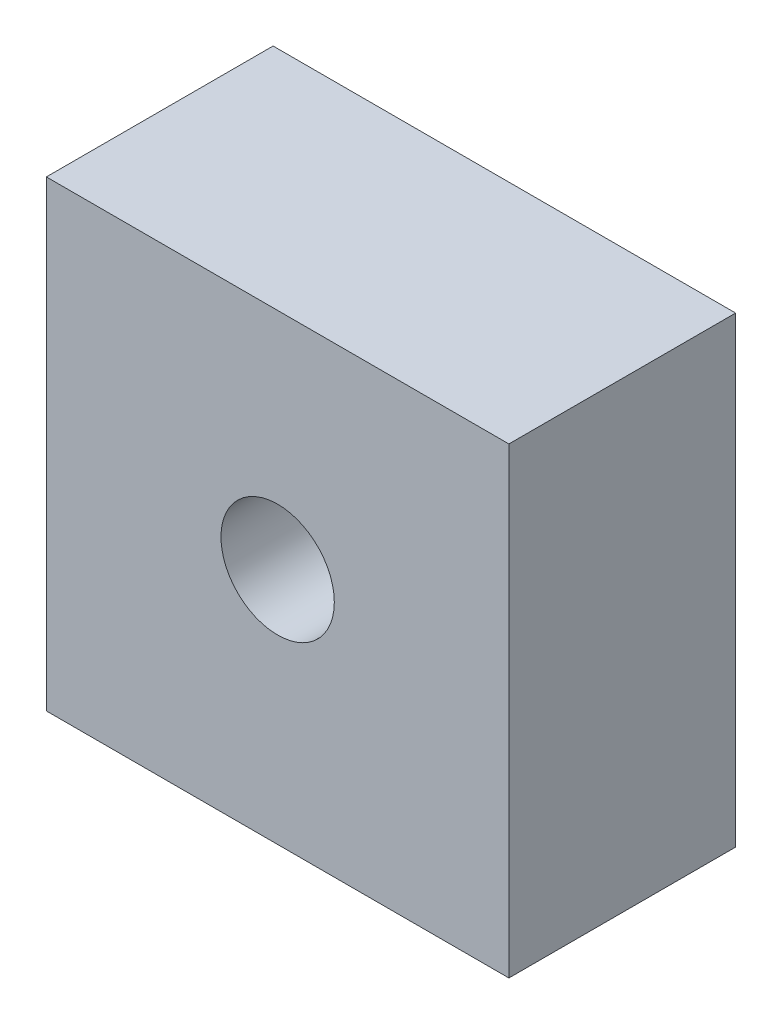
ISO-10303-21;
HEADER;
FILE_DESCRIPTION(('STEP AP214'),'2;1');
FILE_NAME('part.step','',(''),(''),'','','');
FILE_SCHEMA(('AUTOMOTIVE_DESIGN { 1 0 10303 214 1 1 1 1 }'));
ENDSEC;
DATA;
#1=APPLICATION_CONTEXT('core data for automotive mechanical design processes');
#2=APPLICATION_PROTOCOL_DEFINITION('international standard','automotive_design',2000,#1);
#3=PRODUCT_CONTEXT('',#1,'mechanical');
#4=PRODUCT('Part','Part','',(#3));
#5=PRODUCT_RELATED_PRODUCT_CATEGORY('part','',(#4));
#6=PRODUCT_DEFINITION_FORMATION('','',#4);
#7=PRODUCT_DEFINITION_CONTEXT('part definition',#1,'design');
#8=PRODUCT_DEFINITION('design','',#6,#7);
#9=PRODUCT_DEFINITION_SHAPE('','',#8);
#10=(LENGTH_UNIT() NAMED_UNIT(*) SI_UNIT(.MILLI.,.METRE.));
#11=(NAMED_UNIT(*) PLANE_ANGLE_UNIT() SI_UNIT($,.RADIAN.));
#12=(NAMED_UNIT(*) SI_UNIT($,.STERADIAN.) SOLID_ANGLE_UNIT());
#13=UNCERTAINTY_MEASURE_WITH_UNIT(LENGTH_MEASURE(1.E-05),#10,'distance_accuracy_value','');
#14=(GEOMETRIC_REPRESENTATION_CONTEXT(3) GLOBAL_UNCERTAINTY_ASSIGNED_CONTEXT((#13)) GLOBAL_UNIT_ASSIGNED_CONTEXT((#10,
#11,#12)) REPRESENTATION_CONTEXT('',''));
#15=CARTESIAN_POINT('',(0.,0.,0.));
#16=DIRECTION('',(0.,0.,1.));
#17=DIRECTION('',(1.,0.,0.));
#18=AXIS2_PLACEMENT_3D('',#15,#16,#17);
#19=CARTESIAN_POINT('',(0.,-20.7,20.));
#20=DIRECTION('',(0.,1.,0.));
#21=DIRECTION('',(0.,0.,1.));
#22=AXIS2_PLACEMENT_3D('',#19,#20,#21);
#23=PLANE('',#22);
#24=CARTESIAN_POINT('',(-5.,-20.7,9.99999999999999));
#25=DIRECTION('',(0.,-1.,0.));
#26=DIRECTION('',(0.,0.,-1.));
#27=AXIS2_PLACEMENT_3D('',#24,#25,#26);
#28=CIRCLE('',#27,2.5);
#29=CARTESIAN_POINT('',(-5.,-20.7,7.49999999999999));
#30=VERTEX_POINT('',#29);
#31=EDGE_CURVE('E337',#30,#30,#28,.F.);
#32=ORIENTED_EDGE('',*,*,#31,.T.);
#33=EDGE_LOOP('',(#32));
#34=FACE_BOUND('',#33,.T.);
#35=CARTESIAN_POINT('',(5.,-20.7,10.));
#36=DIRECTION('',(0.,-1.,0.));
#37=DIRECTION('',(0.,0.,-1.));
#38=AXIS2_PLACEMENT_3D('',#35,#36,#37);
#39=CIRCLE('',#38,2.5);
#40=CARTESIAN_POINT('',(5.,-20.7,7.5));
#41=VERTEX_POINT('',#40);
#42=EDGE_CURVE('E11',#41,#41,#39,.T.);
#43=ORIENTED_EDGE('',*,*,#42,.F.);
#44=EDGE_LOOP('',(#43));
#45=FACE_BOUND('',#44,.T.);
#46=DIRECTION('',(1.,0.,0.));
#47=VECTOR('',#46,1.);
#48=CARTESIAN_POINT('',(0.,-20.7,0.));
#49=LINE('',#48,#47);
#50=CARTESIAN_POINT('',(-20.4,-20.7,0.));
#51=VERTEX_POINT('',#50);
#52=CARTESIAN_POINT('',(20.4,-20.7,0.));
#53=VERTEX_POINT('',#52);
#54=EDGE_CURVE('E125',#51,#53,#49,.T.);
#55=ORIENTED_EDGE('',*,*,#54,.T.);
#56=DIRECTION('',(0.,0.,-1.));
#57=VECTOR('',#56,1.);
#58=CARTESIAN_POINT('',(20.4,-20.7,20.));
#59=LINE('',#58,#57);
#60=CARTESIAN_POINT('',(20.4,-20.7,20.));
#61=VERTEX_POINT('',#60);
#62=EDGE_CURVE('E53',#61,#53,#59,.T.);
#63=ORIENTED_EDGE('',*,*,#62,.F.);
#64=DIRECTION('',(1.,0.,0.));
#65=VECTOR('',#64,1.);
#66=CARTESIAN_POINT('',(0.,-20.7,20.));
#67=LINE('',#66,#65);
#68=CARTESIAN_POINT('',(-20.4,-20.7,20.));
#69=VERTEX_POINT('',#68);
#70=EDGE_CURVE('E102',#69,#61,#67,.T.);
#71=ORIENTED_EDGE('',*,*,#70,.F.);
#72=DIRECTION('',(0.,0.,-1.));
#73=VECTOR('',#72,1.);
#74=CARTESIAN_POINT('',(-20.4,-20.7,20.));
#75=LINE('',#74,#73);
#76=EDGE_CURVE('E68',#69,#51,#75,.T.);
#77=ORIENTED_EDGE('',*,*,#76,.T.);
#78=EDGE_LOOP('',(#55,#63,#71,#77));
#79=FACE_BOUND('',#78,.T.);
#80=ADVANCED_FACE('F49',(#34,#45,#79),#23,.F.);
#81=CARTESIAN_POINT('',(20.4,0.,20.));
#82=DIRECTION('',(-1.,0.,0.));
#83=DIRECTION('',(0.,-1.,0.));
#84=AXIS2_PLACEMENT_3D('',#81,#82,#83);
#85=PLANE('',#84);
#86=DIRECTION('',(0.,1.,0.));
#87=VECTOR('',#86,1.);
#88=CARTESIAN_POINT('',(20.4,0.,0.));
#89=LINE('',#88,#87);
#90=CARTESIAN_POINT('',(20.4,20.1,0.));
#91=VERTEX_POINT('',#90);
#92=EDGE_CURVE('E109',#53,#91,#89,.T.);
#93=ORIENTED_EDGE('',*,*,#92,.T.);
#94=DIRECTION('',(0.,0.,-1.));
#95=VECTOR('',#94,1.);
#96=CARTESIAN_POINT('',(20.4,20.1,20.));
#97=LINE('',#96,#95);
#98=CARTESIAN_POINT('',(20.4,20.1,20.));
#99=VERTEX_POINT('',#98);
#100=EDGE_CURVE('E107',#99,#91,#97,.T.);
#101=ORIENTED_EDGE('',*,*,#100,.F.);
#102=DIRECTION('',(0.,1.,0.));
#103=VECTOR('',#102,1.);
#104=CARTESIAN_POINT('',(20.4,0.,20.));
#105=LINE('',#104,#103);
#106=EDGE_CURVE('E94',#61,#99,#105,.T.);
#107=ORIENTED_EDGE('',*,*,#106,.F.);
#108=ORIENTED_EDGE('',*,*,#62,.T.);
#109=EDGE_LOOP('',(#93,#101,#107,#108));
#110=FACE_BOUND('',#109,.T.);
#111=ADVANCED_FACE('F108',(#110),#85,.F.);
#112=CARTESIAN_POINT('',(0.,20.1,20.));
#113=DIRECTION('',(0.,1.,0.));
#114=DIRECTION('',(-1.,0.,0.));
#115=AXIS2_PLACEMENT_3D('',#112,#113,#114);
#116=PLANE('',#115);
#117=DIRECTION('',(1.,0.,0.));
#118=VECTOR('',#117,1.);
#119=CARTESIAN_POINT('',(0.,20.1,0.));
#120=LINE('',#119,#118);
#121=CARTESIAN_POINT('',(-20.4,20.1,0.));
#122=VERTEX_POINT('',#121);
#123=EDGE_CURVE('E131',#122,#91,#120,.T.);
#124=ORIENTED_EDGE('',*,*,#123,.F.);
#125=DIRECTION('',(0.,0.,-1.));
#126=VECTOR('',#125,1.);
#127=CARTESIAN_POINT('',(-20.4,20.1,20.));
#128=LINE('',#127,#126);
#129=CARTESIAN_POINT('',(-20.4,20.1,20.));
#130=VERTEX_POINT('',#129);
#131=EDGE_CURVE('E82',#130,#122,#128,.T.);
#132=ORIENTED_EDGE('',*,*,#131,.F.);
#133=DIRECTION('',(1.,0.,0.));
#134=VECTOR('',#133,1.);
#135=CARTESIAN_POINT('',(0.,20.1,20.));
#136=LINE('',#135,#134);
#137=EDGE_CURVE('E101',#130,#99,#136,.T.);
#138=ORIENTED_EDGE('',*,*,#137,.T.);
#139=ORIENTED_EDGE('',*,*,#100,.T.);
#140=EDGE_LOOP('',(#124,#132,#138,#139));
#141=FACE_BOUND('',#140,.T.);
#142=ADVANCED_FACE('F113',(#141),#116,.T.);
#143=CARTESIAN_POINT('',(0.,0.300000000000002,20.));
#144=DIRECTION('',(0.,0.,-1.));
#145=DIRECTION('',(-1.,0.,0.));
#146=AXIS2_PLACEMENT_3D('',#143,#144,#145);
#147=CYLINDRICAL_SURFACE('',#146,5.);
#148=CARTESIAN_POINT('',(0.,0.300000000000002,20.));
#149=DIRECTION('',(0.,0.,1.));
#150=DIRECTION('',(1.,0.,0.));
#151=AXIS2_PLACEMENT_3D('',#148,#149,#150);
#152=CIRCLE('',#151,5.);
#153=CARTESIAN_POINT('',(5.00000000000001,0.300000000000002,20.));
#154=VERTEX_POINT('',#153);
#155=EDGE_CURVE('E138',#154,#154,#152,.T.);
#156=ORIENTED_EDGE('',*,*,#155,.T.);
#157=EDGE_LOOP('',(#156));
#158=FACE_BOUND('',#157,.T.);
#159=CARTESIAN_POINT('',(0.,0.300000000000002,0.));
#160=DIRECTION('',(0.,0.,1.));
#161=DIRECTION('',(1.,0.,0.));
#162=AXIS2_PLACEMENT_3D('',#159,#160,#161);
#163=CIRCLE('',#162,5.);
#164=CARTESIAN_POINT('',(5.00000000000001,0.300000000000002,0.));
#165=VERTEX_POINT('',#164);
#166=EDGE_CURVE('E121',#165,#165,#163,.T.);
#167=ORIENTED_EDGE('',*,*,#166,.F.);
#168=EDGE_LOOP('',(#167));
#169=FACE_BOUND('',#168,.T.);
#170=ADVANCED_FACE('F51',(#158,#169),#147,.F.);
#171=CARTESIAN_POINT('',(-20.4,0.,20.));
#172=DIRECTION('',(-1.,0.,0.));
#173=DIRECTION('',(0.,-1.,0.));
#174=AXIS2_PLACEMENT_3D('',#171,#172,#173);
#175=PLANE('',#174);
#176=DIRECTION('',(0.,1.,0.));
#177=VECTOR('',#176,1.);
#178=CARTESIAN_POINT('',(-20.4,0.,0.));
#179=LINE('',#178,#177);
#180=EDGE_CURVE('E134',#51,#122,#179,.T.);
#181=ORIENTED_EDGE('',*,*,#180,.F.);
#182=ORIENTED_EDGE('',*,*,#76,.F.);
#183=DIRECTION('',(0.,1.,0.));
#184=VECTOR('',#183,1.);
#185=CARTESIAN_POINT('',(-20.4,0.,20.));
#186=LINE('',#185,#184);
#187=EDGE_CURVE('E115',#69,#130,#186,.T.);
#188=ORIENTED_EDGE('',*,*,#187,.T.);
#189=ORIENTED_EDGE('',*,*,#131,.T.);
#190=EDGE_LOOP('',(#181,#182,#188,#189));
#191=FACE_BOUND('',#190,.T.);
#192=ADVANCED_FACE('F145',(#191),#175,.T.);
#193=CARTESIAN_POINT('',(0.,0.,20.));
#194=DIRECTION('',(0.,0.,1.));
#195=DIRECTION('',(1.,0.,0.));
#196=AXIS2_PLACEMENT_3D('',#193,#194,#195);
#197=PLANE('',#196);
#198=ORIENTED_EDGE('',*,*,#155,.F.);
#199=EDGE_LOOP('',(#198));
#200=FACE_BOUND('',#199,.T.);
#201=ORIENTED_EDGE('',*,*,#70,.T.);
#202=ORIENTED_EDGE('',*,*,#106,.T.);
#203=ORIENTED_EDGE('',*,*,#137,.F.);
#204=ORIENTED_EDGE('',*,*,#187,.F.);
#205=EDGE_LOOP('',(#201,#202,#203,#204));
#206=FACE_BOUND('',#205,.T.);
#207=ADVANCED_FACE('F98',(#200,#206),#197,.T.);
#208=CARTESIAN_POINT('',(0.,0.,0.));
#209=DIRECTION('',(0.,0.,1.));
#210=DIRECTION('',(1.,0.,0.));
#211=AXIS2_PLACEMENT_3D('',#208,#209,#210);
#212=PLANE('',#211);
#213=CARTESIAN_POINT('',(17.4,-17.1,0.));
#214=DIRECTION('',(0.,0.,-1.));
#215=DIRECTION('',(-1.,0.,0.));
#216=AXIS2_PLACEMENT_3D('',#213,#214,#215);
#217=CIRCLE('',#216,1.5);
#218=CARTESIAN_POINT('',(15.9,-17.1,0.));
#219=VERTEX_POINT('',#218);
#220=EDGE_CURVE('E325',#219,#219,#217,.T.);
#221=ORIENTED_EDGE('',*,*,#220,.F.);
#222=EDGE_LOOP('',(#221));
#223=FACE_BOUND('',#222,.T.);
#224=CARTESIAN_POINT('',(-17.4,-17.1,0.));
#225=DIRECTION('',(0.,0.,-1.));
#226=DIRECTION('',(-1.,0.,0.));
#227=AXIS2_PLACEMENT_3D('',#224,#225,#226);
#228=CIRCLE('',#227,1.5);
#229=CARTESIAN_POINT('',(-18.9,-17.1,0.));
#230=VERTEX_POINT('',#229);
#231=EDGE_CURVE('E362',#230,#230,#228,.T.);
#232=ORIENTED_EDGE('',*,*,#231,.F.);
#233=EDGE_LOOP('',(#232));
#234=FACE_BOUND('',#233,.T.);
#235=CARTESIAN_POINT('',(-17.4,17.7,0.));
#236=DIRECTION('',(0.,0.,-1.));
#237=DIRECTION('',(-1.,0.,0.));
#238=AXIS2_PLACEMENT_3D('',#235,#236,#237);
#239=CIRCLE('',#238,1.5);
#240=CARTESIAN_POINT('',(-18.9,17.7,0.));
#241=VERTEX_POINT('',#240);
#242=EDGE_CURVE('E342',#241,#241,#239,.T.);
#243=ORIENTED_EDGE('',*,*,#242,.F.);
#244=EDGE_LOOP('',(#243));
#245=FACE_BOUND('',#244,.T.);
#246=CARTESIAN_POINT('',(17.4,17.7,0.));
#247=DIRECTION('',(0.,0.,-1.));
#248=DIRECTION('',(-1.,0.,0.));
#249=AXIS2_PLACEMENT_3D('',#246,#247,#248);
#250=CIRCLE('',#249,1.5);
#251=CARTESIAN_POINT('',(15.9,17.7,0.));
#252=VERTEX_POINT('',#251);
#253=EDGE_CURVE('E338',#252,#252,#250,.T.);
#254=ORIENTED_EDGE('',*,*,#253,.F.);
#255=EDGE_LOOP('',(#254));
#256=FACE_BOUND('',#255,.T.);
#257=ORIENTED_EDGE('',*,*,#166,.T.);
#258=EDGE_LOOP('',(#257));
#259=FACE_BOUND('',#258,.T.);
#260=ORIENTED_EDGE('',*,*,#54,.F.);
#261=ORIENTED_EDGE('',*,*,#180,.T.);
#262=ORIENTED_EDGE('',*,*,#123,.T.);
#263=ORIENTED_EDGE('',*,*,#92,.F.);
#264=EDGE_LOOP('',(#260,#261,#262,#263));
#265=FACE_BOUND('',#264,.T.);
#266=ADVANCED_FACE('F144',(#223,#234,#245,#256,#259,#265),#212,.F.);
#267=CARTESIAN_POINT('',(5.,-25.7,10.));
#268=DIRECTION('',(0.,1.,0.));
#269=DIRECTION('',(0.,0.,1.));
#270=AXIS2_PLACEMENT_3D('',#267,#268,#269);
#271=CYLINDRICAL_SURFACE('',#270,2.5);
#272=CARTESIAN_POINT('',(5.,-25.7,10.));
#273=DIRECTION('',(0.,-1.,0.));
#274=DIRECTION('',(0.,0.,-1.));
#275=AXIS2_PLACEMENT_3D('',#272,#273,#274);
#276=CIRCLE('',#275,2.5);
#277=CARTESIAN_POINT('',(5.,-25.7,7.5));
#278=VERTEX_POINT('',#277);
#279=EDGE_CURVE('E126',#278,#278,#276,.T.);
#280=ORIENTED_EDGE('',*,*,#279,.F.);
#281=EDGE_LOOP('',(#280));
#282=FACE_BOUND('',#281,.T.);
#283=ORIENTED_EDGE('',*,*,#42,.T.);
#284=EDGE_LOOP('',(#283));
#285=FACE_BOUND('',#284,.T.);
#286=ADVANCED_FACE('F196',(#282,#285),#271,.T.);
#287=CARTESIAN_POINT('',(0.,-25.7,0.));
#288=DIRECTION('',(0.,-1.,0.));
#289=DIRECTION('',(0.,0.,-1.));
#290=AXIS2_PLACEMENT_3D('',#287,#288,#289);
#291=PLANE('',#290);
#292=ORIENTED_EDGE('',*,*,#279,.T.);
#293=EDGE_LOOP('',(#292));
#294=FACE_BOUND('',#293,.T.);
#295=ADVANCED_FACE('F207',(#294),#291,.T.);
#296=CARTESIAN_POINT('',(-5.,-25.7,9.99999999999999));
#297=DIRECTION('',(0.,1.,0.));
#298=DIRECTION('',(0.,0.,1.));
#299=AXIS2_PLACEMENT_3D('',#296,#297,#298);
#300=CYLINDRICAL_SURFACE('',#299,2.5);
#301=CARTESIAN_POINT('',(-5.,-25.7,9.99999999999999));
#302=DIRECTION('',(0.,-1.,0.));
#303=DIRECTION('',(0.,0.,-1.));
#304=AXIS2_PLACEMENT_3D('',#301,#302,#303);
#305=CIRCLE('',#304,2.5);
#306=CARTESIAN_POINT('',(-5.,-25.7,7.49999999999999));
#307=VERTEX_POINT('',#306);
#308=EDGE_CURVE('E343',#307,#307,#305,.F.);
#309=ORIENTED_EDGE('',*,*,#308,.T.);
#310=EDGE_LOOP('',(#309));
#311=FACE_BOUND('',#310,.T.);
#312=ORIENTED_EDGE('',*,*,#31,.F.);
#313=EDGE_LOOP('',(#312));
#314=FACE_BOUND('',#313,.T.);
#315=ADVANCED_FACE('F218',(#311,#314),#300,.T.);
#316=CARTESIAN_POINT('',(0.,-25.7,0.));
#317=DIRECTION('',(0.,-1.,0.));
#318=DIRECTION('',(0.,0.,-1.));
#319=AXIS2_PLACEMENT_3D('',#316,#317,#318);
#320=PLANE('',#319);
#321=ORIENTED_EDGE('',*,*,#308,.F.);
#322=EDGE_LOOP('',(#321));
#323=FACE_BOUND('',#322,.T.);
#324=ADVANCED_FACE('F229',(#323),#320,.T.);
#325=CARTESIAN_POINT('',(17.4,17.7,3.));
#326=DIRECTION('',(0.,0.,-1.));
#327=DIRECTION('',(-1.,0.,0.));
#328=AXIS2_PLACEMENT_3D('',#325,#326,#327);
#329=CYLINDRICAL_SURFACE('',#328,1.5);
#330=CARTESIAN_POINT('',(17.4,17.7,3.));
#331=DIRECTION('',(0.,0.,-1.));
#332=DIRECTION('',(-1.,0.,0.));
#333=AXIS2_PLACEMENT_3D('',#330,#331,#332);
#334=CIRCLE('',#333,1.5);
#335=CARTESIAN_POINT('',(15.9,17.7,3.));
#336=VERTEX_POINT('',#335);
#337=EDGE_CURVE('E333',#336,#336,#334,.T.);
#338=ORIENTED_EDGE('',*,*,#337,.F.);
#339=EDGE_LOOP('',(#338));
#340=FACE_BOUND('',#339,.T.);
#341=ORIENTED_EDGE('',*,*,#253,.T.);
#342=EDGE_LOOP('',(#341));
#343=FACE_BOUND('',#342,.T.);
#344=ADVANCED_FACE('F239',(#340,#343),#329,.F.);
#345=CARTESIAN_POINT('',(17.4,17.7,3.));
#346=DIRECTION('',(0.,0.,-1.));
#347=DIRECTION('',(-1.,0.,0.));
#348=AXIS2_PLACEMENT_3D('',#345,#346,#347);
#349=PLANE('',#348);
#350=ORIENTED_EDGE('',*,*,#337,.T.);
#351=EDGE_LOOP('',(#350));
#352=FACE_BOUND('',#351,.T.);
#353=ADVANCED_FACE('F248',(#352),#349,.T.);
#354=CARTESIAN_POINT('',(-17.4,17.7,3.));
#355=DIRECTION('',(0.,0.,-1.));
#356=DIRECTION('',(-1.,0.,0.));
#357=AXIS2_PLACEMENT_3D('',#354,#355,#356);
#358=CYLINDRICAL_SURFACE('',#357,1.5);
#359=CARTESIAN_POINT('',(-17.4,17.7,3.));
#360=DIRECTION('',(0.,0.,-1.));
#361=DIRECTION('',(-1.,0.,0.));
#362=AXIS2_PLACEMENT_3D('',#359,#360,#361);
#363=CIRCLE('',#362,1.5);
#364=CARTESIAN_POINT('',(-18.9,17.7,3.));
#365=VERTEX_POINT('',#364);
#366=EDGE_CURVE('E358',#365,#365,#363,.T.);
#367=ORIENTED_EDGE('',*,*,#366,.F.);
#368=EDGE_LOOP('',(#367));
#369=FACE_BOUND('',#368,.T.);
#370=ORIENTED_EDGE('',*,*,#242,.T.);
#371=EDGE_LOOP('',(#370));
#372=FACE_BOUND('',#371,.T.);
#373=ADVANCED_FACE('F258',(#369,#372),#358,.F.);
#374=CARTESIAN_POINT('',(-17.4,17.7,3.));
#375=DIRECTION('',(0.,0.,-1.));
#376=DIRECTION('',(-1.,0.,0.));
#377=AXIS2_PLACEMENT_3D('',#374,#375,#376);
#378=PLANE('',#377);
#379=ORIENTED_EDGE('',*,*,#366,.T.);
#380=EDGE_LOOP('',(#379));
#381=FACE_BOUND('',#380,.T.);
#382=ADVANCED_FACE('F268',(#381),#378,.T.);
#383=CARTESIAN_POINT('',(-17.4,-17.1,3.));
#384=DIRECTION('',(0.,0.,-1.));
#385=DIRECTION('',(-1.,0.,0.));
#386=AXIS2_PLACEMENT_3D('',#383,#384,#385);
#387=CYLINDRICAL_SURFACE('',#386,1.5);
#388=CARTESIAN_POINT('',(-17.4,-17.1,3.));
#389=DIRECTION('',(0.,0.,-1.));
#390=DIRECTION('',(-1.,0.,0.));
#391=AXIS2_PLACEMENT_3D('',#388,#389,#390);
#392=CIRCLE('',#391,1.5);
#393=CARTESIAN_POINT('',(-18.9,-17.1,3.));
#394=VERTEX_POINT('',#393);
#395=EDGE_CURVE('E329',#394,#394,#392,.T.);
#396=ORIENTED_EDGE('',*,*,#395,.F.);
#397=EDGE_LOOP('',(#396));
#398=FACE_BOUND('',#397,.T.);
#399=ORIENTED_EDGE('',*,*,#231,.T.);
#400=EDGE_LOOP('',(#399));
#401=FACE_BOUND('',#400,.T.);
#402=ADVANCED_FACE('F278',(#398,#401),#387,.F.);
#403=CARTESIAN_POINT('',(-17.4,-17.1,3.));
#404=DIRECTION('',(0.,0.,-1.));
#405=DIRECTION('',(-1.,0.,0.));
#406=AXIS2_PLACEMENT_3D('',#403,#404,#405);
#407=PLANE('',#406);
#408=ORIENTED_EDGE('',*,*,#395,.T.);
#409=EDGE_LOOP('',(#408));
#410=FACE_BOUND('',#409,.T.);
#411=ADVANCED_FACE('F288',(#410),#407,.T.);
#412=CARTESIAN_POINT('',(17.4,-17.1,3.));
#413=DIRECTION('',(0.,0.,-1.));
#414=DIRECTION('',(-1.,0.,0.));
#415=AXIS2_PLACEMENT_3D('',#412,#413,#414);
#416=CYLINDRICAL_SURFACE('',#415,1.5);
#417=CARTESIAN_POINT('',(17.4,-17.1,3.));
#418=DIRECTION('',(0.,0.,-1.));
#419=DIRECTION('',(-1.,0.,0.));
#420=AXIS2_PLACEMENT_3D('',#417,#418,#419);
#421=CIRCLE('',#420,1.5);
#422=CARTESIAN_POINT('',(15.9,-17.1,3.));
#423=VERTEX_POINT('',#422);
#424=EDGE_CURVE('E323',#423,#423,#421,.T.);
#425=ORIENTED_EDGE('',*,*,#424,.F.);
#426=EDGE_LOOP('',(#425));
#427=FACE_BOUND('',#426,.T.);
#428=ORIENTED_EDGE('',*,*,#220,.T.);
#429=EDGE_LOOP('',(#428));
#430=FACE_BOUND('',#429,.T.);
#431=ADVANCED_FACE('F298',(#427,#430),#416,.F.);
#432=CARTESIAN_POINT('',(17.4,-17.1,3.));
#433=DIRECTION('',(0.,0.,-1.));
#434=DIRECTION('',(-1.,0.,0.));
#435=AXIS2_PLACEMENT_3D('',#432,#433,#434);
#436=PLANE('',#435);
#437=ORIENTED_EDGE('',*,*,#424,.T.);
#438=EDGE_LOOP('',(#437));
#439=FACE_BOUND('',#438,.T.);
#440=ADVANCED_FACE('F308',(#439),#436,.T.);
#441=CLOSED_SHELL('',(#80,#111,#142,#170,#192,#207,#266,#286,#295,#315,#324,#344,#353,#373,#382,
#402,#411,#431,#440));
#442=MANIFOLD_SOLID_BREP('B2',#441);
#443=ADVANCED_BREP_SHAPE_REPRESENTATION('',(#18,#442),#14);
#444=SHAPE_DEFINITION_REPRESENTATION(#9,#443);
ENDSEC;
END-ISO-10303-21;
